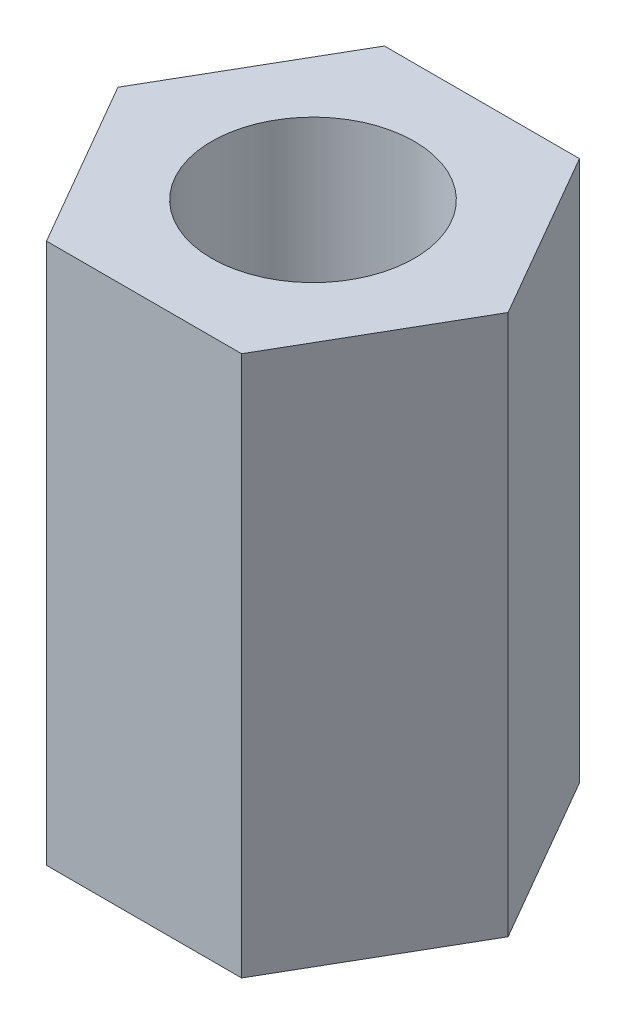
ISO-10303-21;
HEADER;
FILE_DESCRIPTION(('STEP AP214'),'2;1');
FILE_NAME('part.step','',(''),(''),'','','');
FILE_SCHEMA(('AUTOMOTIVE_DESIGN { 1 0 10303 214 1 1 1 1 }'));
ENDSEC;
DATA;
#1=APPLICATION_CONTEXT('core data for automotive mechanical design processes');
#2=APPLICATION_PROTOCOL_DEFINITION('international standard','automotive_design',2000,#1);
#3=PRODUCT_CONTEXT('',#1,'mechanical');
#4=PRODUCT('Part','Part','',(#3));
#5=PRODUCT_RELATED_PRODUCT_CATEGORY('part','',(#4));
#6=PRODUCT_DEFINITION_FORMATION('','',#4);
#7=PRODUCT_DEFINITION_CONTEXT('part definition',#1,'design');
#8=PRODUCT_DEFINITION('design','',#6,#7);
#9=PRODUCT_DEFINITION_SHAPE('','',#8);
#10=(LENGTH_UNIT() NAMED_UNIT(*) SI_UNIT(.MILLI.,.METRE.));
#11=(NAMED_UNIT(*) PLANE_ANGLE_UNIT() SI_UNIT($,.RADIAN.));
#12=(NAMED_UNIT(*) SI_UNIT($,.STERADIAN.) SOLID_ANGLE_UNIT());
#13=UNCERTAINTY_MEASURE_WITH_UNIT(LENGTH_MEASURE(1.E-05),#10,'distance_accuracy_value','');
#14=(GEOMETRIC_REPRESENTATION_CONTEXT(3) GLOBAL_UNCERTAINTY_ASSIGNED_CONTEXT((#13)) GLOBAL_UNIT_ASSIGNED_CONTEXT((#10,
#11,#12)) REPRESENTATION_CONTEXT('',''));
#15=CARTESIAN_POINT('',(0.,0.,0.));
#16=DIRECTION('',(0.,0.,1.));
#17=DIRECTION('',(1.,0.,0.));
#18=AXIS2_PLACEMENT_3D('',#15,#16,#17);
#19=CARTESIAN_POINT('',(0.,4.,0.));
#20=DIRECTION('',(0.,1.,0.));
#21=DIRECTION('',(0.,0.,1.));
#22=AXIS2_PLACEMENT_3D('',#19,#20,#21);
#23=PLANE('',#22);
#24=DIRECTION('',(1.,0.,0.));
#25=VECTOR('',#24,1.);
#26=CARTESIAN_POINT('',(-1.44337567297405,4.,2.5));
#27=LINE('',#26,#25);
#28=CARTESIAN_POINT('',(-1.44337567297405,4.,2.5));
#29=VERTEX_POINT('',#28);
#30=CARTESIAN_POINT('',(1.44337567297408,4.,2.5));
#31=VERTEX_POINT('',#30);
#32=EDGE_CURVE('E128',#29,#31,#27,.T.);
#33=ORIENTED_EDGE('',*,*,#32,.T.);
#34=DIRECTION('',(0.500000000000001,0.,-0.866025403784438));
#35=VECTOR('',#34,1.);
#36=CARTESIAN_POINT('',(1.44337567297408,4.,2.5));
#37=LINE('',#36,#35);
#38=CARTESIAN_POINT('',(2.88675134594815,4.,0.));
#39=VERTEX_POINT('',#38);
#40=EDGE_CURVE('E86',#31,#39,#37,.T.);
#41=ORIENTED_EDGE('',*,*,#40,.T.);
#42=DIRECTION('',(-0.500000000000001,0.,-0.866025403784438));
#43=VECTOR('',#42,1.);
#44=CARTESIAN_POINT('',(2.88675134594815,4.,0.));
#45=LINE('',#44,#43);
#46=CARTESIAN_POINT('',(1.44337567297408,4.,-2.50000000000001));
#47=VERTEX_POINT('',#46);
#48=EDGE_CURVE('E99',#39,#47,#45,.T.);
#49=ORIENTED_EDGE('',*,*,#48,.T.);
#50=DIRECTION('',(-1.,0.,0.));
#51=VECTOR('',#50,1.);
#52=CARTESIAN_POINT('',(1.44337567297408,4.,-2.50000000000001));
#53=LINE('',#52,#51);
#54=CARTESIAN_POINT('',(-1.44337567297405,4.,-2.50000000000001));
#55=VERTEX_POINT('',#54);
#56=EDGE_CURVE('E93',#47,#55,#53,.T.);
#57=ORIENTED_EDGE('',*,*,#56,.T.);
#58=DIRECTION('',(-0.5,0.,0.866025403784438));
#59=VECTOR('',#58,1.);
#60=CARTESIAN_POINT('',(-1.44337567297405,4.,-2.50000000000001));
#61=LINE('',#60,#59);
#62=CARTESIAN_POINT('',(-2.88675134594812,4.,0.));
#63=VERTEX_POINT('',#62);
#64=EDGE_CURVE('E97',#55,#63,#61,.T.);
#65=ORIENTED_EDGE('',*,*,#64,.T.);
#66=DIRECTION('',(0.5,0.,0.866025403784438));
#67=VECTOR('',#66,1.);
#68=CARTESIAN_POINT('',(-2.88675134594812,4.,0.));
#69=LINE('',#68,#67);
#70=EDGE_CURVE('E49',#63,#29,#69,.T.);
#71=ORIENTED_EDGE('',*,*,#70,.T.);
#72=EDGE_LOOP('',(#33,#41,#49,#57,#65,#71));
#73=FACE_BOUND('',#72,.T.);
#74=CARTESIAN_POINT('',(0.,4.,0.));
#75=DIRECTION('',(0.,1.,0.));
#76=DIRECTION('',(0.,0.,1.));
#77=AXIS2_PLACEMENT_3D('',#74,#75,#76);
#78=CIRCLE('',#77,1.5);
#79=CARTESIAN_POINT('',(0.,4.,1.5));
#80=VERTEX_POINT('',#79);
#81=EDGE_CURVE('E121',#80,#80,#78,.T.);
#82=ORIENTED_EDGE('',*,*,#81,.F.);
#83=EDGE_LOOP('',(#82));
#84=FACE_BOUND('',#83,.T.);
#85=ADVANCED_FACE('F32',(#73,#84),#23,.T.);
#86=CARTESIAN_POINT('',(0.,-4.,0.));
#87=DIRECTION('',(0.,1.,0.));
#88=DIRECTION('',(0.,0.,1.));
#89=AXIS2_PLACEMENT_3D('',#86,#87,#88);
#90=PLANE('',#89);
#91=DIRECTION('',(1.,0.,0.));
#92=VECTOR('',#91,1.);
#93=CARTESIAN_POINT('',(-1.44337567297405,-4.,2.5));
#94=LINE('',#93,#92);
#95=CARTESIAN_POINT('',(-1.44337567297405,-4.,2.5));
#96=VERTEX_POINT('',#95);
#97=CARTESIAN_POINT('',(1.44337567297408,-4.,2.5));
#98=VERTEX_POINT('',#97);
#99=EDGE_CURVE('E117',#96,#98,#94,.T.);
#100=ORIENTED_EDGE('',*,*,#99,.F.);
#101=DIRECTION('',(0.5,0.,0.866025403784438));
#102=VECTOR('',#101,1.);
#103=CARTESIAN_POINT('',(-2.88675134594812,-4.,0.));
#104=LINE('',#103,#102);
#105=CARTESIAN_POINT('',(-2.88675134594812,-4.,0.));
#106=VERTEX_POINT('',#105);
#107=EDGE_CURVE('E78',#106,#96,#104,.T.);
#108=ORIENTED_EDGE('',*,*,#107,.F.);
#109=DIRECTION('',(-0.5,0.,0.866025403784438));
#110=VECTOR('',#109,1.);
#111=CARTESIAN_POINT('',(-1.44337567297405,-4.,-2.50000000000001));
#112=LINE('',#111,#110);
#113=CARTESIAN_POINT('',(-1.44337567297405,-4.,-2.50000000000001));
#114=VERTEX_POINT('',#113);
#115=EDGE_CURVE('E72',#114,#106,#112,.T.);
#116=ORIENTED_EDGE('',*,*,#115,.F.);
#117=DIRECTION('',(-1.,0.,0.));
#118=VECTOR('',#117,1.);
#119=CARTESIAN_POINT('',(1.44337567297408,-4.,-2.50000000000001));
#120=LINE('',#119,#118);
#121=CARTESIAN_POINT('',(1.44337567297408,-4.,-2.50000000000001));
#122=VERTEX_POINT('',#121);
#123=EDGE_CURVE('E107',#122,#114,#120,.T.);
#124=ORIENTED_EDGE('',*,*,#123,.F.);
#125=DIRECTION('',(-0.500000000000001,0.,-0.866025403784438));
#126=VECTOR('',#125,1.);
#127=CARTESIAN_POINT('',(2.88675134594815,-4.,0.));
#128=LINE('',#127,#126);
#129=CARTESIAN_POINT('',(2.88675134594815,-4.,0.));
#130=VERTEX_POINT('',#129);
#131=EDGE_CURVE('E123',#130,#122,#128,.T.);
#132=ORIENTED_EDGE('',*,*,#131,.F.);
#133=DIRECTION('',(0.500000000000001,0.,-0.866025403784438));
#134=VECTOR('',#133,1.);
#135=CARTESIAN_POINT('',(1.44337567297408,-4.,2.5));
#136=LINE('',#135,#134);
#137=EDGE_CURVE('E120',#98,#130,#136,.T.);
#138=ORIENTED_EDGE('',*,*,#137,.F.);
#139=EDGE_LOOP('',(#100,#108,#116,#124,#132,#138));
#140=FACE_BOUND('',#139,.T.);
#141=CARTESIAN_POINT('',(0.,-4.,0.));
#142=DIRECTION('',(0.,1.,0.));
#143=DIRECTION('',(0.,0.,1.));
#144=AXIS2_PLACEMENT_3D('',#141,#142,#143);
#145=CIRCLE('',#144,1.5);
#146=CARTESIAN_POINT('',(0.,-4.,1.5));
#147=VERTEX_POINT('',#146);
#148=EDGE_CURVE('E221',#147,#147,#145,.T.);
#149=ORIENTED_EDGE('',*,*,#148,.T.);
#150=EDGE_LOOP('',(#149));
#151=FACE_BOUND('',#150,.T.);
#152=ADVANCED_FACE('F137',(#140,#151),#90,.F.);
#153=CARTESIAN_POINT('',(-1.44337567297405,4.,2.5));
#154=DIRECTION('',(0.,0.,-1.));
#155=DIRECTION('',(-1.,0.,0.));
#156=AXIS2_PLACEMENT_3D('',#153,#154,#155);
#157=PLANE('',#156);
#158=ORIENTED_EDGE('',*,*,#99,.T.);
#159=DIRECTION('',(0.,-1.,0.));
#160=VECTOR('',#159,1.);
#161=CARTESIAN_POINT('',(1.44337567297408,4.,2.5));
#162=LINE('',#161,#160);
#163=EDGE_CURVE('E11',#31,#98,#162,.T.);
#164=ORIENTED_EDGE('',*,*,#163,.F.);
#165=ORIENTED_EDGE('',*,*,#32,.F.);
#166=DIRECTION('',(0.,-1.,0.));
#167=VECTOR('',#166,1.);
#168=CARTESIAN_POINT('',(-1.44337567297405,4.,2.5));
#169=LINE('',#168,#167);
#170=EDGE_CURVE('E113',#29,#96,#169,.T.);
#171=ORIENTED_EDGE('',*,*,#170,.T.);
#172=EDGE_LOOP('',(#158,#164,#165,#171));
#173=FACE_BOUND('',#172,.T.);
#174=ADVANCED_FACE('F34',(#173),#157,.F.);
#175=CARTESIAN_POINT('',(1.44337567297408,4.,2.5));
#176=DIRECTION('',(-0.866025403784438,0.,-0.500000000000001));
#177=DIRECTION('',(-0.500000000000001,0.,0.866025403784438));
#178=AXIS2_PLACEMENT_3D('',#175,#176,#177);
#179=PLANE('',#178);
#180=ORIENTED_EDGE('',*,*,#137,.T.);
#181=DIRECTION('',(0.,-1.,0.));
#182=VECTOR('',#181,1.);
#183=CARTESIAN_POINT('',(2.88675134594815,4.,0.));
#184=LINE('',#183,#182);
#185=EDGE_CURVE('E41',#39,#130,#184,.T.);
#186=ORIENTED_EDGE('',*,*,#185,.F.);
#187=ORIENTED_EDGE('',*,*,#40,.F.);
#188=ORIENTED_EDGE('',*,*,#163,.T.);
#189=EDGE_LOOP('',(#180,#186,#187,#188));
#190=FACE_BOUND('',#189,.T.);
#191=ADVANCED_FACE('F162',(#190),#179,.F.);
#192=CARTESIAN_POINT('',(2.88675134594815,4.,0.));
#193=DIRECTION('',(-0.866025403784438,0.,0.500000000000001));
#194=DIRECTION('',(0.500000000000001,0.,0.866025403784438));
#195=AXIS2_PLACEMENT_3D('',#192,#193,#194);
#196=PLANE('',#195);
#197=ORIENTED_EDGE('',*,*,#131,.T.);
#198=DIRECTION('',(0.,-1.,0.));
#199=VECTOR('',#198,1.);
#200=CARTESIAN_POINT('',(1.44337567297408,4.,-2.50000000000001));
#201=LINE('',#200,#199);
#202=EDGE_CURVE('E108',#47,#122,#201,.T.);
#203=ORIENTED_EDGE('',*,*,#202,.F.);
#204=ORIENTED_EDGE('',*,*,#48,.F.);
#205=ORIENTED_EDGE('',*,*,#185,.T.);
#206=EDGE_LOOP('',(#197,#203,#204,#205));
#207=FACE_BOUND('',#206,.T.);
#208=ADVANCED_FACE('F134',(#207),#196,.F.);
#209=CARTESIAN_POINT('',(1.44337567297408,4.,-2.50000000000001));
#210=DIRECTION('',(0.,0.,1.));
#211=DIRECTION('',(1.,0.,0.));
#212=AXIS2_PLACEMENT_3D('',#209,#210,#211);
#213=PLANE('',#212);
#214=ORIENTED_EDGE('',*,*,#123,.T.);
#215=DIRECTION('',(0.,-1.,0.));
#216=VECTOR('',#215,1.);
#217=CARTESIAN_POINT('',(-1.44337567297405,4.,-2.50000000000001));
#218=LINE('',#217,#216);
#219=EDGE_CURVE('E104',#55,#114,#218,.T.);
#220=ORIENTED_EDGE('',*,*,#219,.F.);
#221=ORIENTED_EDGE('',*,*,#56,.F.);
#222=ORIENTED_EDGE('',*,*,#202,.T.);
#223=EDGE_LOOP('',(#214,#220,#221,#222));
#224=FACE_BOUND('',#223,.T.);
#225=ADVANCED_FACE('F105',(#224),#213,.F.);
#226=CARTESIAN_POINT('',(-1.44337567297405,4.,-2.50000000000001));
#227=DIRECTION('',(0.866025403784439,0.,0.5));
#228=DIRECTION('',(0.5,0.,-0.866025403784439));
#229=AXIS2_PLACEMENT_3D('',#226,#227,#228);
#230=PLANE('',#229);
#231=ORIENTED_EDGE('',*,*,#115,.T.);
#232=DIRECTION('',(0.,-1.,0.));
#233=VECTOR('',#232,1.);
#234=CARTESIAN_POINT('',(-2.88675134594812,4.,0.));
#235=LINE('',#234,#233);
#236=EDGE_CURVE('E109',#63,#106,#235,.T.);
#237=ORIENTED_EDGE('',*,*,#236,.F.);
#238=ORIENTED_EDGE('',*,*,#64,.F.);
#239=ORIENTED_EDGE('',*,*,#219,.T.);
#240=EDGE_LOOP('',(#231,#237,#238,#239));
#241=FACE_BOUND('',#240,.T.);
#242=ADVANCED_FACE('F111',(#241),#230,.F.);
#243=CARTESIAN_POINT('',(-2.88675134594812,4.,0.));
#244=DIRECTION('',(0.866025403784438,0.,-0.5));
#245=DIRECTION('',(-0.5,0.,-0.866025403784438));
#246=AXIS2_PLACEMENT_3D('',#243,#244,#245);
#247=PLANE('',#246);
#248=ORIENTED_EDGE('',*,*,#107,.T.);
#249=ORIENTED_EDGE('',*,*,#170,.F.);
#250=ORIENTED_EDGE('',*,*,#70,.F.);
#251=ORIENTED_EDGE('',*,*,#236,.T.);
#252=EDGE_LOOP('',(#248,#249,#250,#251));
#253=FACE_BOUND('',#252,.T.);
#254=ADVANCED_FACE('F142',(#253),#247,.F.);
#255=CARTESIAN_POINT('',(0.,4.,0.));
#256=DIRECTION('',(0.,-1.,0.));
#257=DIRECTION('',(0.,0.,-1.));
#258=AXIS2_PLACEMENT_3D('',#255,#256,#257);
#259=CYLINDRICAL_SURFACE('',#258,1.5);
#260=ORIENTED_EDGE('',*,*,#81,.T.);
#261=EDGE_LOOP('',(#260));
#262=FACE_BOUND('',#261,.T.);
#263=ORIENTED_EDGE('',*,*,#148,.F.);
#264=EDGE_LOOP('',(#263));
#265=FACE_BOUND('',#264,.T.);
#266=ADVANCED_FACE('F144',(#262,#265),#259,.F.);
#267=CLOSED_SHELL('',(#85,#152,#174,#191,#208,#225,#242,#254,#266));
#268=MANIFOLD_SOLID_BREP('B2',#267);
#269=ADVANCED_BREP_SHAPE_REPRESENTATION('',(#18,#268),#14);
#270=SHAPE_DEFINITION_REPRESENTATION(#9,#269);
ENDSEC;
END-ISO-10303-21;
